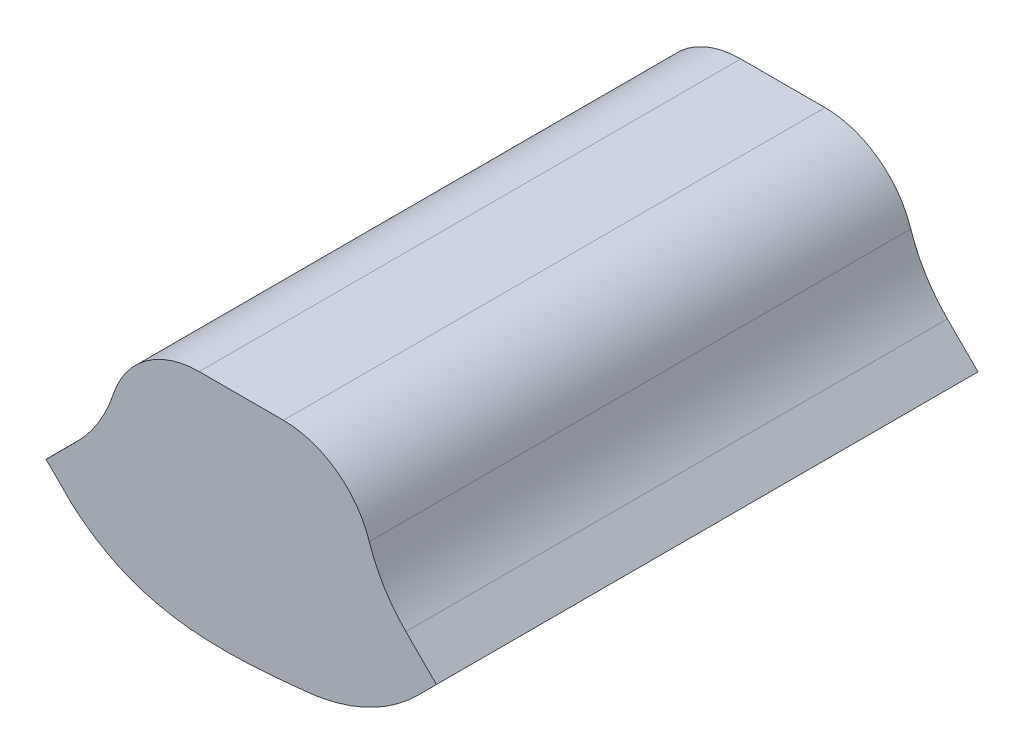
ISO-10303-21;
HEADER;
FILE_DESCRIPTION(('STEP AP214'),'2;1');
FILE_NAME('part.step','',(''),(''),'','','');
FILE_SCHEMA(('AUTOMOTIVE_DESIGN { 1 0 10303 214 1 1 1 1 }'));
ENDSEC;
DATA;
#1=APPLICATION_CONTEXT('core data for automotive mechanical design processes');
#2=APPLICATION_PROTOCOL_DEFINITION('international standard','automotive_design',2000,#1);
#3=PRODUCT_CONTEXT('',#1,'mechanical');
#4=PRODUCT('Part','Part','',(#3));
#5=PRODUCT_RELATED_PRODUCT_CATEGORY('part','',(#4));
#6=PRODUCT_DEFINITION_FORMATION('','',#4);
#7=PRODUCT_DEFINITION_CONTEXT('part definition',#1,'design');
#8=PRODUCT_DEFINITION('design','',#6,#7);
#9=PRODUCT_DEFINITION_SHAPE('','',#8);
#10=(LENGTH_UNIT() NAMED_UNIT(*) SI_UNIT(.MILLI.,.METRE.));
#11=(NAMED_UNIT(*) PLANE_ANGLE_UNIT() SI_UNIT($,.RADIAN.));
#12=(NAMED_UNIT(*) SI_UNIT($,.STERADIAN.) SOLID_ANGLE_UNIT());
#13=UNCERTAINTY_MEASURE_WITH_UNIT(LENGTH_MEASURE(1.E-05),#10,'distance_accuracy_value','');
#14=(GEOMETRIC_REPRESENTATION_CONTEXT(3) GLOBAL_UNCERTAINTY_ASSIGNED_CONTEXT((#13)) GLOBAL_UNIT_ASSIGNED_CONTEXT((#10,
#11,#12)) REPRESENTATION_CONTEXT('',''));
#15=CARTESIAN_POINT('',(0.,0.,0.));
#16=DIRECTION('',(0.,0.,1.));
#17=DIRECTION('',(1.,0.,0.));
#18=AXIS2_PLACEMENT_3D('',#15,#16,#17);
#19=CARTESIAN_POINT('',(0.,0.,-18.));
#20=DIRECTION('',(0.,0.,-1.));
#21=DIRECTION('',(-1.,0.,0.));
#22=AXIS2_PLACEMENT_3D('',#19,#20,#21);
#23=PLANE('',#22);
#24=CARTESIAN_POINT('',(-10.79445453323,-9.034648971964,-18.));
#25=CARTESIAN_POINT('',(-10.2838146698486,-8.97954464898747,-18.));
#26=CARTESIAN_POINT('',(-9.79207434744676,-8.83947158193158,-18.));
#27=CARTESIAN_POINT('',(-9.29601109202704,-8.69816712005428,-18.));
#28=CARTESIAN_POINT('',(-8.83341181069668,-8.476523794548,-18.));
#29=CARTESIAN_POINT('',(-8.36939427651418,-8.25420094728015,-18.));
#30=CARTESIAN_POINT('',(-7.94811145755708,-7.95599531666317,-18.));
#31=CARTESIAN_POINT('',(-7.52826735335988,-7.65880808229436,-18.));
#32=CARTESIAN_POINT('',(-7.163105933668,-7.293646662601,-18.));
#33=B_SPLINE_CURVE_WITH_KNOTS('',2,(#24,#25,#26,#27,#28,#29,#30,#31,#32),.UNSPECIFIED.,.F.,.F.,
(3,2,2,2,3),(0.,0.25,0.5,0.75,1.),.UNSPECIFIED.);
#34=CARTESIAN_POINT('',(-10.79445453323,-9.034648971964,-18.));
#35=VERTEX_POINT('',#34);
#36=CARTESIAN_POINT('',(-7.163105933668,-7.293646662601,-18.));
#37=VERTEX_POINT('',#36);
#38=EDGE_CURVE('E47',#35,#37,#33,.T.);
#39=ORIENTED_EDGE('',*,*,#38,.F.);
#40=CARTESIAN_POINT('',(-18.67047777516,-7.534870351738,-18.));
#41=CARTESIAN_POINT('',(-18.12513114378,-8.012979969245,-18.));
#42=CARTESIAN_POINT('',(-17.27722824849,-8.540037203897,-18.));
#43=CARTESIAN_POINT('',(-16.06645608301,-8.958058573779,-18.));
#44=CARTESIAN_POINT('',(-14.80624787817,-9.200473351071,-18.));
#45=CARTESIAN_POINT('',(-13.12086106257,-9.255335570536,-18.));
#46=CARTESIAN_POINT('',(-11.66836770555,-9.128182371334,-18.));
#47=CARTESIAN_POINT('',(-10.87412086803,-9.043245859248,-18.));
#48=CARTESIAN_POINT('',(-10.79445453323,-9.034648971964,-18.));
#49=(BOUNDED_CURVE() B_SPLINE_CURVE(3,(#40,#41,#42,#43,#44,#45,#46,#47,#48),.UNSPECIFIED.,.F.,
.F.) B_SPLINE_CURVE_WITH_KNOTS((4,1,1,1,1,1,4),(0.,0.2310478315194,0.3513828304271,
0.4817457459104,0.7168777083957,0.971604001088,1.),
.UNSPECIFIED.) CURVE() GEOMETRIC_REPRESENTATION_ITEM() RATIONAL_B_SPLINE_CURVE((1.,1.,1.,1.,1.,
1.,1.,1.,1.)) REPRESENTATION_ITEM(''));
#50=CARTESIAN_POINT('',(-18.67047777516,-7.534870351738,-18.));
#51=VERTEX_POINT('',#50);
#52=EDGE_CURVE('E196',#51,#35,#49,.T.);
#53=ORIENTED_EDGE('',*,*,#52,.F.);
#54=DIRECTION('',(0.70714752281681,-0.707066037208725,0.));
#55=VECTOR('',#54,1.);
#56=CARTESIAN_POINT('',(-19.52478034457,-6.68066622482,-18.));
#57=LINE('',#56,#55);
#58=CARTESIAN_POINT('',(-19.52478034457,-6.68066622482,-18.));
#59=VERTEX_POINT('',#58);
#60=EDGE_CURVE('E198',#59,#51,#57,.T.);
#61=ORIENTED_EDGE('',*,*,#60,.F.);
#62=DIRECTION('',(-0.730924084009559,-0.682458777813566,0.));
#63=VECTOR('',#62,1.);
#64=CARTESIAN_POINT('',(-19.45159406784,-6.612332702827,-18.));
#65=LINE('',#64,#63);
#66=CARTESIAN_POINT('',(-19.45159406784,-6.612332702827,-18.));
#67=VERTEX_POINT('',#66);
#68=EDGE_CURVE('E209',#67,#59,#65,.T.);
#69=ORIENTED_EDGE('',*,*,#68,.F.);
#70=DIRECTION('',(-0.707106781189151,-0.707106781183944,0.));
#71=VECTOR('',#70,1.);
#72=CARTESIAN_POINT('',(-18.50063501422,-5.661373649214,-18.));
#73=LINE('',#72,#71);
#74=CARTESIAN_POINT('',(-18.5006350142203,-5.66137364921372,-18.));
#75=VERTEX_POINT('',#74);
#76=EDGE_CURVE('E218',#75,#67,#73,.T.);
#77=ORIENTED_EDGE('',*,*,#76,.F.);
#78=CARTESIAN_POINT('',(-22.03616892016,-2.125839743281,-18.));
#79=DIRECTION('',(0.,0.,-1.));
#80=DIRECTION('',(-1.,0.,0.));
#81=AXIS2_PLACEMENT_3D('',#78,#79,#80);
#82=CIRCLE('',#81,5.00000000000492);
#83=CARTESIAN_POINT('',(-17.2838112502514,-3.67989784299656,-18.));
#84=VERTEX_POINT('',#83);
#85=EDGE_CURVE('E222',#84,#75,#82,.T.);
#86=ORIENTED_EDGE('',*,*,#85,.F.);
#87=CARTESIAN_POINT('',(-14.43239664831,-4.612332702827,-18.));
#88=DIRECTION('',(0.,0.,-1.));
#89=DIRECTION('',(-1.,0.,0.));
#90=AXIS2_PLACEMENT_3D('',#87,#88,#89);
#91=CIRCLE('',#90,2.99999999999857);
#92=CARTESIAN_POINT('',(-14.43239664831,-1.612332702827,-18.));
#93=VERTEX_POINT('',#92);
#94=EDGE_CURVE('E226',#93,#84,#91,.F.);
#95=ORIENTED_EDGE('',*,*,#94,.F.);
#96=DIRECTION('',(-1.,0.,0.));
#97=VECTOR('',#96,1.);
#98=CARTESIAN_POINT('',(-14.43239664831,-1.612332702827,-18.));
#99=LINE('',#98,#97);
#100=CARTESIAN_POINT('',(-11.63153012236,-1.6123327028251,-18.));
#101=VERTEX_POINT('',#100);
#102=EDGE_CURVE('E230',#101,#93,#99,.T.);
#103=ORIENTED_EDGE('',*,*,#102,.F.);
#104=CARTESIAN_POINT('',(-11.63153012236,-4.612332702827,-18.));
#105=DIRECTION('',(0.,0.,-1.));
#106=DIRECTION('',(-1.,0.,0.));
#107=AXIS2_PLACEMENT_3D('',#104,#105,#106);
#108=CIRCLE('',#107,3.0000000000019);
#109=CARTESIAN_POINT('',(-8.78011552041295,-3.67989784299698,-18.));
#110=VERTEX_POINT('',#109);
#111=EDGE_CURVE('E234',#110,#101,#108,.F.);
#112=ORIENTED_EDGE('',*,*,#111,.F.);
#113=CARTESIAN_POINT('',(-4.027757850508,-2.125839743281,-18.));
#114=DIRECTION('',(0.,0.,-1.));
#115=DIRECTION('',(-1.,0.,0.));
#116=AXIS2_PLACEMENT_3D('',#113,#114,#115);
#117=CIRCLE('',#116,4.99999999999972);
#118=CARTESIAN_POINT('',(-7.56329175644,-5.661373649214,-18.));
#119=VERTEX_POINT('',#118);
#120=EDGE_CURVE('E95',#119,#110,#117,.T.);
#121=ORIENTED_EDGE('',*,*,#120,.F.);
#122=DIRECTION('',(-0.707106781186548,0.707106781186548,0.));
#123=VECTOR('',#122,1.);
#124=CARTESIAN_POINT('',(-6.612332702827,-6.612332702827,-18.));
#125=LINE('',#124,#123);
#126=CARTESIAN_POINT('',(-6.5470623383604,-6.67760306729363,-18.));
#127=VERTEX_POINT('',#126);
#128=EDGE_CURVE('E100',#127,#119,#125,.T.);
#129=ORIENTED_EDGE('',*,*,#128,.F.);
#130=DIRECTION('',(0.707106781186677,0.707106781186418,0.));
#131=VECTOR('',#130,1.);
#132=CARTESIAN_POINT('',(-7.163105933668,-7.293646662601,-18.));
#133=LINE('',#132,#131);
#134=EDGE_CURVE('E139',#37,#127,#133,.T.);
#135=ORIENTED_EDGE('',*,*,#134,.F.);
#136=EDGE_LOOP('',(#39,#53,#61,#69,#77,#86,#95,#103,#112,#121,#129,#135));
#137=FACE_BOUND('',#136,.T.);
#138=ADVANCED_FACE('F38',(#137),#23,.T.);
#139=CARTESIAN_POINT('',(-8.83341181069668,-8.476523794548,0.));
#140=DIRECTION('',(0.,0.,1.));
#141=DIRECTION('',(1.,0.,0.));
#142=AXIS2_PLACEMENT_3D('',#139,#140,#141);
#143=PLANE('',#142);
#144=CARTESIAN_POINT('',(-7.163105933668,-7.293646662601,0.));
#145=CARTESIAN_POINT('',(-7.52826735335988,-7.65880808229436,0.));
#146=CARTESIAN_POINT('',(-7.94811145755708,-7.95599531666317,0.));
#147=CARTESIAN_POINT('',(-8.36939427651418,-8.25420094728015,0.));
#148=CARTESIAN_POINT('',(-8.83341181069668,-8.476523794548,0.));
#149=CARTESIAN_POINT('',(-9.29601109202704,-8.69816712005428,0.));
#150=CARTESIAN_POINT('',(-9.79207434744676,-8.83947158193158,0.));
#151=CARTESIAN_POINT('',(-10.2838146698486,-8.97954464898747,0.));
#152=CARTESIAN_POINT('',(-10.79445453323,-9.034648971964,0.));
#153=B_SPLINE_CURVE_WITH_KNOTS('',2,(#144,#145,#146,#147,#148,#149,#150,#151,#152),
.UNSPECIFIED.,.F.,.F.,(3,2,2,2,3),(0.,0.25,0.5,0.75,1.),.UNSPECIFIED.);
#154=CARTESIAN_POINT('',(-10.79445453323,-9.034648971964,0.));
#155=VERTEX_POINT('',#154);
#156=CARTESIAN_POINT('',(-7.163105933668,-7.293646662601,0.));
#157=VERTEX_POINT('',#156);
#158=EDGE_CURVE('E150',#155,#157,#153,.F.);
#159=ORIENTED_EDGE('',*,*,#158,.T.);
#160=DIRECTION('',(0.707106781186677,0.707106781186418,0.));
#161=VECTOR('',#160,1.);
#162=CARTESIAN_POINT('',(-7.163105933668,-7.293646662601,0.));
#163=LINE('',#162,#161);
#164=CARTESIAN_POINT('',(-6.5470623383604,-6.67760306729363,0.));
#165=VERTEX_POINT('',#164);
#166=EDGE_CURVE('E137',#157,#165,#163,.T.);
#167=ORIENTED_EDGE('',*,*,#166,.T.);
#168=DIRECTION('',(-0.707106781186548,0.707106781186548,0.));
#169=VECTOR('',#168,1.);
#170=CARTESIAN_POINT('',(-6.612332702827,-6.612332702827,0.));
#171=LINE('',#170,#169);
#172=CARTESIAN_POINT('',(-7.56329175644,-5.661373649214,0.));
#173=VERTEX_POINT('',#172);
#174=EDGE_CURVE('E142',#165,#173,#171,.T.);
#175=ORIENTED_EDGE('',*,*,#174,.T.);
#176=CARTESIAN_POINT('',(-4.027757850508,-2.125839743281,0.));
#177=DIRECTION('',(0.,0.,-1.));
#178=DIRECTION('',(1.,0.,0.));
#179=AXIS2_PLACEMENT_3D('',#176,#177,#178);
#180=CIRCLE('',#179,4.99999999999972);
#181=CARTESIAN_POINT('',(-8.78011552041295,-3.67989784299698,0.));
#182=VERTEX_POINT('',#181);
#183=EDGE_CURVE('E146',#173,#182,#180,.T.);
#184=ORIENTED_EDGE('',*,*,#183,.T.);
#185=CARTESIAN_POINT('',(-11.63153012236,-4.612332702827,0.));
#186=DIRECTION('',(0.,0.,1.));
#187=DIRECTION('',(1.,0.,0.));
#188=AXIS2_PLACEMENT_3D('',#185,#186,#187);
#189=CIRCLE('',#188,3.0000000000019);
#190=CARTESIAN_POINT('',(-11.63153012236,-1.6123327028251,0.));
#191=VERTEX_POINT('',#190);
#192=EDGE_CURVE('E251',#182,#191,#189,.T.);
#193=ORIENTED_EDGE('',*,*,#192,.T.);
#194=DIRECTION('',(-1.,0.,0.));
#195=VECTOR('',#194,1.);
#196=CARTESIAN_POINT('',(-14.43239664831,-1.612332702827,0.));
#197=LINE('',#196,#195);
#198=CARTESIAN_POINT('',(-14.43239664831,-1.612332702827,0.));
#199=VERTEX_POINT('',#198);
#200=EDGE_CURVE('E256',#191,#199,#197,.T.);
#201=ORIENTED_EDGE('',*,*,#200,.T.);
#202=CARTESIAN_POINT('',(-14.43239664831,-4.612332702827,0.));
#203=DIRECTION('',(0.,0.,1.));
#204=DIRECTION('',(1.,0.,0.));
#205=AXIS2_PLACEMENT_3D('',#202,#203,#204);
#206=CIRCLE('',#205,2.99999999999857);
#207=CARTESIAN_POINT('',(-17.2838112502514,-3.67989784299656,0.));
#208=VERTEX_POINT('',#207);
#209=EDGE_CURVE('E295',#199,#208,#206,.T.);
#210=ORIENTED_EDGE('',*,*,#209,.T.);
#211=CARTESIAN_POINT('',(-22.03616892016,-2.125839743281,0.));
#212=DIRECTION('',(0.,0.,-1.));
#213=DIRECTION('',(1.,0.,0.));
#214=AXIS2_PLACEMENT_3D('',#211,#212,#213);
#215=CIRCLE('',#214,5.00000000000492);
#216=CARTESIAN_POINT('',(-18.5006350142203,-5.66137364921372,0.));
#217=VERTEX_POINT('',#216);
#218=EDGE_CURVE('E292',#208,#217,#215,.T.);
#219=ORIENTED_EDGE('',*,*,#218,.T.);
#220=DIRECTION('',(-0.707106781189151,-0.707106781183944,0.));
#221=VECTOR('',#220,1.);
#222=CARTESIAN_POINT('',(-18.50063501422,-5.661373649214,0.));
#223=LINE('',#222,#221);
#224=CARTESIAN_POINT('',(-19.45159406784,-6.612332702827,0.));
#225=VERTEX_POINT('',#224);
#226=EDGE_CURVE('E289',#217,#225,#223,.T.);
#227=ORIENTED_EDGE('',*,*,#226,.T.);
#228=DIRECTION('',(-0.730924084009559,-0.682458777813566,0.));
#229=VECTOR('',#228,1.);
#230=CARTESIAN_POINT('',(-19.45159406784,-6.612332702827,0.));
#231=LINE('',#230,#229);
#232=CARTESIAN_POINT('',(-19.52478034457,-6.68066622482,0.));
#233=VERTEX_POINT('',#232);
#234=EDGE_CURVE('E286',#225,#233,#231,.T.);
#235=ORIENTED_EDGE('',*,*,#234,.T.);
#236=DIRECTION('',(0.70714752281681,-0.707066037208724,0.));
#237=VECTOR('',#236,1.);
#238=CARTESIAN_POINT('',(-19.52478034457,-6.68066622482,0.));
#239=LINE('',#238,#237);
#240=CARTESIAN_POINT('',(-18.67047777516,-7.534870351738,0.));
#241=VERTEX_POINT('',#240);
#242=EDGE_CURVE('E272',#233,#241,#239,.T.);
#243=ORIENTED_EDGE('',*,*,#242,.T.);
#244=CARTESIAN_POINT('',(-10.79445453323,-9.034648971964,0.));
#245=CARTESIAN_POINT('',(-10.87412086803,-9.043245859248,0.));
#246=CARTESIAN_POINT('',(-11.66836770555,-9.128182371334,0.));
#247=CARTESIAN_POINT('',(-13.12086106257,-9.255335570536,0.));
#248=CARTESIAN_POINT('',(-14.80624787817,-9.200473351071,0.));
#249=CARTESIAN_POINT('',(-16.06645608301,-8.958058573779,0.));
#250=CARTESIAN_POINT('',(-17.27722824849,-8.540037203897,0.));
#251=CARTESIAN_POINT('',(-18.12513114378,-8.012979969245,0.));
#252=CARTESIAN_POINT('',(-18.67047777516,-7.534870351738,0.));
#253=(BOUNDED_CURVE() B_SPLINE_CURVE(3,(#244,#245,#246,#247,#248,#249,#250,#251,#252),
.UNSPECIFIED.,.F.,.F.) B_SPLINE_CURVE_WITH_KNOTS((4,1,1,1,1,1,4),(0.,0.028395998912,
0.2831222916043,0.5182542540896,0.6486171695729,0.7689521684806,1.),
.UNSPECIFIED.) CURVE() GEOMETRIC_REPRESENTATION_ITEM() RATIONAL_B_SPLINE_CURVE((1.,1.,1.,1.,1.,
1.,1.,1.,1.)) REPRESENTATION_ITEM(''));
#254=EDGE_CURVE('E261',#241,#155,#253,.F.);
#255=ORIENTED_EDGE('',*,*,#254,.T.);
#256=EDGE_LOOP('',(#159,#167,#175,#184,#193,#201,#210,#219,#227,#235,#243,#255));
#257=FACE_BOUND('',#256,.T.);
#258=ADVANCED_FACE('F148',(#257),#143,.T.);
#259=CARTESIAN_POINT('',(-7.163105933668,-7.293646662601,-33.0610974860577));
#260=DIRECTION('',(0.707106781186418,-0.707106781186677,0.));
#261=DIRECTION('',(0.707106781186677,0.707106781186418,0.));
#262=AXIS2_PLACEMENT_3D('',#259,#260,#261);
#263=PLANE('',#262);
#264=DIRECTION('',(0.,0.,1.));
#265=VECTOR('',#264,1.);
#266=CARTESIAN_POINT('',(-7.163105933668,-7.293646662601,-33.0610974860577));
#267=LINE('',#266,#265);
#268=EDGE_CURVE('E11',#37,#157,#267,.T.);
#269=ORIENTED_EDGE('',*,*,#268,.F.);
#270=ORIENTED_EDGE('',*,*,#134,.T.);
#271=DIRECTION('',(0.,0.,1.));
#272=VECTOR('',#271,1.);
#273=CARTESIAN_POINT('',(-6.5470623383604,-6.67760306729363,-33.0610974860577));
#274=LINE('',#273,#272);
#275=EDGE_CURVE('E134',#127,#165,#274,.T.);
#276=ORIENTED_EDGE('',*,*,#275,.T.);
#277=ORIENTED_EDGE('',*,*,#166,.F.);
#278=EDGE_LOOP('',(#269,#270,#276,#277));
#279=FACE_BOUND('',#278,.T.);
#280=ADVANCED_FACE('F135',(#279),#263,.T.);
#281=CARTESIAN_POINT('',(-6.612332702827,-6.612332702827,-33.0610974860577));
#282=DIRECTION('',(0.707106781186548,0.707106781186548,0.));
#283=DIRECTION('',(-0.707106781186548,0.707106781186548,0.));
#284=AXIS2_PLACEMENT_3D('',#281,#282,#283);
#285=PLANE('',#284);
#286=ORIENTED_EDGE('',*,*,#275,.F.);
#287=ORIENTED_EDGE('',*,*,#128,.T.);
#288=DIRECTION('',(0.,0.,1.));
#289=VECTOR('',#288,1.);
#290=CARTESIAN_POINT('',(-7.56329175644,-5.661373649214,-33.0610974860577));
#291=LINE('',#290,#289);
#292=EDGE_CURVE('E129',#119,#173,#291,.T.);
#293=ORIENTED_EDGE('',*,*,#292,.T.);
#294=ORIENTED_EDGE('',*,*,#174,.F.);
#295=EDGE_LOOP('',(#286,#287,#293,#294));
#296=FACE_BOUND('',#295,.T.);
#297=ADVANCED_FACE('F143',(#296),#285,.T.);
#298=CARTESIAN_POINT('',(-4.027757850508,-2.125839743281,-33.0610974860577));
#299=DIRECTION('',(0.,0.,1.));
#300=DIRECTION('',(1.,0.,0.));
#301=AXIS2_PLACEMENT_3D('',#298,#299,#300);
#302=CYLINDRICAL_SURFACE('',#301,4.99999999999972);
#303=ORIENTED_EDGE('',*,*,#292,.F.);
#304=ORIENTED_EDGE('',*,*,#120,.T.);
#305=DIRECTION('',(0.,0.,1.));
#306=VECTOR('',#305,1.);
#307=CARTESIAN_POINT('',(-8.78011552041295,-3.67989784299698,-33.0610974860577));
#308=LINE('',#307,#306);
#309=EDGE_CURVE('E237',#110,#182,#308,.T.);
#310=ORIENTED_EDGE('',*,*,#309,.T.);
#311=ORIENTED_EDGE('',*,*,#183,.F.);
#312=EDGE_LOOP('',(#303,#304,#310,#311));
#313=FACE_BOUND('',#312,.T.);
#314=ADVANCED_FACE('F248',(#313),#302,.F.);
#315=CARTESIAN_POINT('',(-11.63153012236,-4.612332702827,-33.0610974860577));
#316=DIRECTION('',(0.,0.,1.));
#317=DIRECTION('',(1.,0.,0.));
#318=AXIS2_PLACEMENT_3D('',#315,#316,#317);
#319=CYLINDRICAL_SURFACE('',#318,3.0000000000019);
#320=ORIENTED_EDGE('',*,*,#309,.F.);
#321=ORIENTED_EDGE('',*,*,#111,.T.);
#322=DIRECTION('',(0.,0.,1.));
#323=VECTOR('',#322,1.);
#324=CARTESIAN_POINT('',(-11.63153012236,-1.6123327028251,-33.0610974860577));
#325=LINE('',#324,#323);
#326=EDGE_CURVE('E233',#101,#191,#325,.T.);
#327=ORIENTED_EDGE('',*,*,#326,.T.);
#328=ORIENTED_EDGE('',*,*,#192,.F.);
#329=EDGE_LOOP('',(#320,#321,#327,#328));
#330=FACE_BOUND('',#329,.T.);
#331=ADVANCED_FACE('F252',(#330),#319,.T.);
#332=CARTESIAN_POINT('',(-14.43239664831,-1.612332702827,-33.0610974860577));
#333=DIRECTION('',(0.,1.,0.));
#334=DIRECTION('',(0.,0.,1.));
#335=AXIS2_PLACEMENT_3D('',#332,#333,#334);
#336=PLANE('',#335);
#337=ORIENTED_EDGE('',*,*,#326,.F.);
#338=ORIENTED_EDGE('',*,*,#102,.T.);
#339=DIRECTION('',(0.,0.,1.));
#340=VECTOR('',#339,1.);
#341=CARTESIAN_POINT('',(-14.43239664831,-1.612332702827,-33.0610974860577));
#342=LINE('',#341,#340);
#343=EDGE_CURVE('E229',#93,#199,#342,.T.);
#344=ORIENTED_EDGE('',*,*,#343,.T.);
#345=ORIENTED_EDGE('',*,*,#200,.F.);
#346=EDGE_LOOP('',(#337,#338,#344,#345));
#347=FACE_BOUND('',#346,.T.);
#348=ADVANCED_FACE('F299',(#347),#336,.T.);
#349=CARTESIAN_POINT('',(-14.43239664831,-4.612332702827,-33.0610974860577));
#350=DIRECTION('',(0.,0.,1.));
#351=DIRECTION('',(1.,0.,0.));
#352=AXIS2_PLACEMENT_3D('',#349,#350,#351);
#353=CYLINDRICAL_SURFACE('',#352,2.99999999999857);
#354=ORIENTED_EDGE('',*,*,#343,.F.);
#355=ORIENTED_EDGE('',*,*,#94,.T.);
#356=DIRECTION('',(0.,0.,1.));
#357=VECTOR('',#356,1.);
#358=CARTESIAN_POINT('',(-17.2838112502514,-3.67989784299656,-33.0610974860577));
#359=LINE('',#358,#357);
#360=EDGE_CURVE('E225',#84,#208,#359,.T.);
#361=ORIENTED_EDGE('',*,*,#360,.T.);
#362=ORIENTED_EDGE('',*,*,#209,.F.);
#363=EDGE_LOOP('',(#354,#355,#361,#362));
#364=FACE_BOUND('',#363,.T.);
#365=ADVANCED_FACE('F302',(#364),#353,.T.);
#366=CARTESIAN_POINT('',(-22.03616892016,-2.125839743281,-33.0610974860577));
#367=DIRECTION('',(0.,0.,1.));
#368=DIRECTION('',(1.,0.,0.));
#369=AXIS2_PLACEMENT_3D('',#366,#367,#368);
#370=CYLINDRICAL_SURFACE('',#369,5.00000000000492);
#371=ORIENTED_EDGE('',*,*,#360,.F.);
#372=ORIENTED_EDGE('',*,*,#85,.T.);
#373=DIRECTION('',(0.,0.,1.));
#374=VECTOR('',#373,1.);
#375=CARTESIAN_POINT('',(-18.5006350142203,-5.66137364921372,-33.0610974860577));
#376=LINE('',#375,#374);
#377=EDGE_CURVE('E221',#75,#217,#376,.T.);
#378=ORIENTED_EDGE('',*,*,#377,.T.);
#379=ORIENTED_EDGE('',*,*,#218,.F.);
#380=EDGE_LOOP('',(#371,#372,#378,#379));
#381=FACE_BOUND('',#380,.T.);
#382=ADVANCED_FACE('F306',(#381),#370,.F.);
#383=CARTESIAN_POINT('',(-18.50063501422,-5.661373649214,-33.0610974860577));
#384=DIRECTION('',(-0.707106781183944,0.707106781189151,0.));
#385=DIRECTION('',(-0.707106781189151,-0.707106781183944,0.));
#386=AXIS2_PLACEMENT_3D('',#383,#384,#385);
#387=PLANE('',#386);
#388=ORIENTED_EDGE('',*,*,#377,.F.);
#389=ORIENTED_EDGE('',*,*,#76,.T.);
#390=DIRECTION('',(0.,0.,1.));
#391=VECTOR('',#390,1.);
#392=CARTESIAN_POINT('',(-19.45159406784,-6.612332702827,-33.0610974860577));
#393=LINE('',#392,#391);
#394=EDGE_CURVE('E217',#67,#225,#393,.T.);
#395=ORIENTED_EDGE('',*,*,#394,.T.);
#396=ORIENTED_EDGE('',*,*,#226,.F.);
#397=EDGE_LOOP('',(#388,#389,#395,#396));
#398=FACE_BOUND('',#397,.T.);
#399=ADVANCED_FACE('F311',(#398),#387,.T.);
#400=CARTESIAN_POINT('',(-19.45159406784,-6.612332702827,-33.0610974860577));
#401=DIRECTION('',(-0.682458777813566,0.730924084009559,0.));
#402=DIRECTION('',(-0.730924084009559,-0.682458777813566,0.));
#403=AXIS2_PLACEMENT_3D('',#400,#401,#402);
#404=PLANE('',#403);
#405=ORIENTED_EDGE('',*,*,#394,.F.);
#406=ORIENTED_EDGE('',*,*,#68,.T.);
#407=DIRECTION('',(0.,0.,1.));
#408=VECTOR('',#407,1.);
#409=CARTESIAN_POINT('',(-19.52478034457,-6.68066622482,-33.0610974860577));
#410=LINE('',#409,#408);
#411=EDGE_CURVE('E206',#59,#233,#410,.T.);
#412=ORIENTED_EDGE('',*,*,#411,.T.);
#413=ORIENTED_EDGE('',*,*,#234,.F.);
#414=EDGE_LOOP('',(#405,#406,#412,#413));
#415=FACE_BOUND('',#414,.T.);
#416=ADVANCED_FACE('F314',(#415),#404,.T.);
#417=CARTESIAN_POINT('',(-19.52478034457,-6.68066622482,-33.0610974860577));
#418=DIRECTION('',(-0.707066037208725,-0.70714752281681,0.));
#419=DIRECTION('',(0.70714752281681,-0.707066037208725,0.));
#420=AXIS2_PLACEMENT_3D('',#417,#418,#419);
#421=PLANE('',#420);
#422=ORIENTED_EDGE('',*,*,#411,.F.);
#423=ORIENTED_EDGE('',*,*,#60,.T.);
#424=DIRECTION('',(0.,0.,1.));
#425=VECTOR('',#424,1.);
#426=CARTESIAN_POINT('',(-18.67047777516,-7.534870351738,-33.0610974860577));
#427=LINE('',#426,#425);
#428=EDGE_CURVE('E197',#51,#241,#427,.T.);
#429=ORIENTED_EDGE('',*,*,#428,.T.);
#430=ORIENTED_EDGE('',*,*,#242,.F.);
#431=EDGE_LOOP('',(#422,#423,#429,#430));
#432=FACE_BOUND('',#431,.T.);
#433=ADVANCED_FACE('F315',(#432),#421,.T.);
#434=CARTESIAN_POINT('',(-18.67047777516,-7.534870351738,-33.0610974860577));
#435=CARTESIAN_POINT('',(-18.12513114378,-8.012979969245,-33.0610974860577));
#436=CARTESIAN_POINT('',(-17.27722824849,-8.540037203897,-33.0610974860577));
#437=CARTESIAN_POINT('',(-16.06645608301,-8.958058573779,-33.0610974860577));
#438=CARTESIAN_POINT('',(-14.80624787817,-9.200473351071,-33.0610974860577));
#439=CARTESIAN_POINT('',(-13.12086106257,-9.255335570536,-33.0610974860577));
#440=CARTESIAN_POINT('',(-11.66836770555,-9.128182371334,-33.0610974860577));
#441=CARTESIAN_POINT('',(-10.87412086803,-9.043245859248,-33.0610974860577));
#442=CARTESIAN_POINT('',(-10.79445453323,-9.034648971964,-33.0610974860577));
#443=(BOUNDED_CURVE() B_SPLINE_CURVE(3,(#434,#435,#436,#437,#438,#439,#440,#441,#442),
.UNSPECIFIED.,.F.,.F.) B_SPLINE_CURVE_WITH_KNOTS((4,1,1,1,1,1,4),(0.,0.2310478315194,
0.3513828304271,0.4817457459104,0.7168777083957,0.971604001088,1.),
.UNSPECIFIED.) CURVE() GEOMETRIC_REPRESENTATION_ITEM() RATIONAL_B_SPLINE_CURVE((1.,1.,1.,1.,1.,
1.,1.,1.,1.)) REPRESENTATION_ITEM(''));
#444=DIRECTION('',(0.,0.,1.));
#445=VECTOR('',#444,1.);
#446=SURFACE_OF_LINEAR_EXTRUSION('',#443,#445);
#447=ORIENTED_EDGE('',*,*,#428,.F.);
#448=ORIENTED_EDGE('',*,*,#52,.T.);
#449=DIRECTION('',(0.,0.,1.));
#450=VECTOR('',#449,1.);
#451=CARTESIAN_POINT('',(-10.79445453323,-9.034648971964,-33.0610974860577));
#452=LINE('',#451,#450);
#453=EDGE_CURVE('E194',#35,#155,#452,.T.);
#454=ORIENTED_EDGE('',*,*,#453,.T.);
#455=ORIENTED_EDGE('',*,*,#254,.F.);
#456=EDGE_LOOP('',(#447,#448,#454,#455));
#457=FACE_BOUND('',#456,.T.);
#458=ADVANCED_FACE('F172',(#457),#446,.T.);
#459=CARTESIAN_POINT('',(-10.79445453323,-9.034648971964,-33.0610974860577));
#460=CARTESIAN_POINT('',(-10.2838146698486,-8.97954464898747,-33.0610974860577));
#461=CARTESIAN_POINT('',(-9.79207434744676,-8.83947158193158,-33.0610974860577));
#462=CARTESIAN_POINT('',(-9.29601109202704,-8.69816712005428,-33.0610974860577));
#463=CARTESIAN_POINT('',(-8.83341181069668,-8.476523794548,-33.0610974860577));
#464=CARTESIAN_POINT('',(-8.36939427651418,-8.25420094728015,-33.0610974860577));
#465=CARTESIAN_POINT('',(-7.94811145755708,-7.95599531666317,-33.0610974860577));
#466=CARTESIAN_POINT('',(-7.52826735335988,-7.65880808229436,-33.0610974860577));
#467=CARTESIAN_POINT('',(-7.163105933668,-7.293646662601,-33.0610974860577));
#468=B_SPLINE_CURVE_WITH_KNOTS('',2,(#459,#460,#461,#462,#463,#464,#465,#466,#467),
.UNSPECIFIED.,.F.,.F.,(3,2,2,2,3),(0.,0.25,0.5,0.75,1.),.UNSPECIFIED.);
#469=DIRECTION('',(0.,0.,1.));
#470=VECTOR('',#469,1.);
#471=SURFACE_OF_LINEAR_EXTRUSION('',#468,#470);
#472=ORIENTED_EDGE('',*,*,#453,.F.);
#473=ORIENTED_EDGE('',*,*,#38,.T.);
#474=ORIENTED_EDGE('',*,*,#268,.T.);
#475=ORIENTED_EDGE('',*,*,#158,.F.);
#476=EDGE_LOOP('',(#472,#473,#474,#475));
#477=FACE_BOUND('',#476,.T.);
#478=ADVANCED_FACE('F161',(#477),#471,.T.);
#479=CLOSED_SHELL('',(#138,#258,#280,#297,#314,#331,#348,#365,#382,#399,#416,#433,#458,#478));
#480=MANIFOLD_SOLID_BREP('B2',#479);
#481=ADVANCED_BREP_SHAPE_REPRESENTATION('',(#18,#480),#14);
#482=SHAPE_DEFINITION_REPRESENTATION(#9,#481);
ENDSEC;
END-ISO-10303-21;
